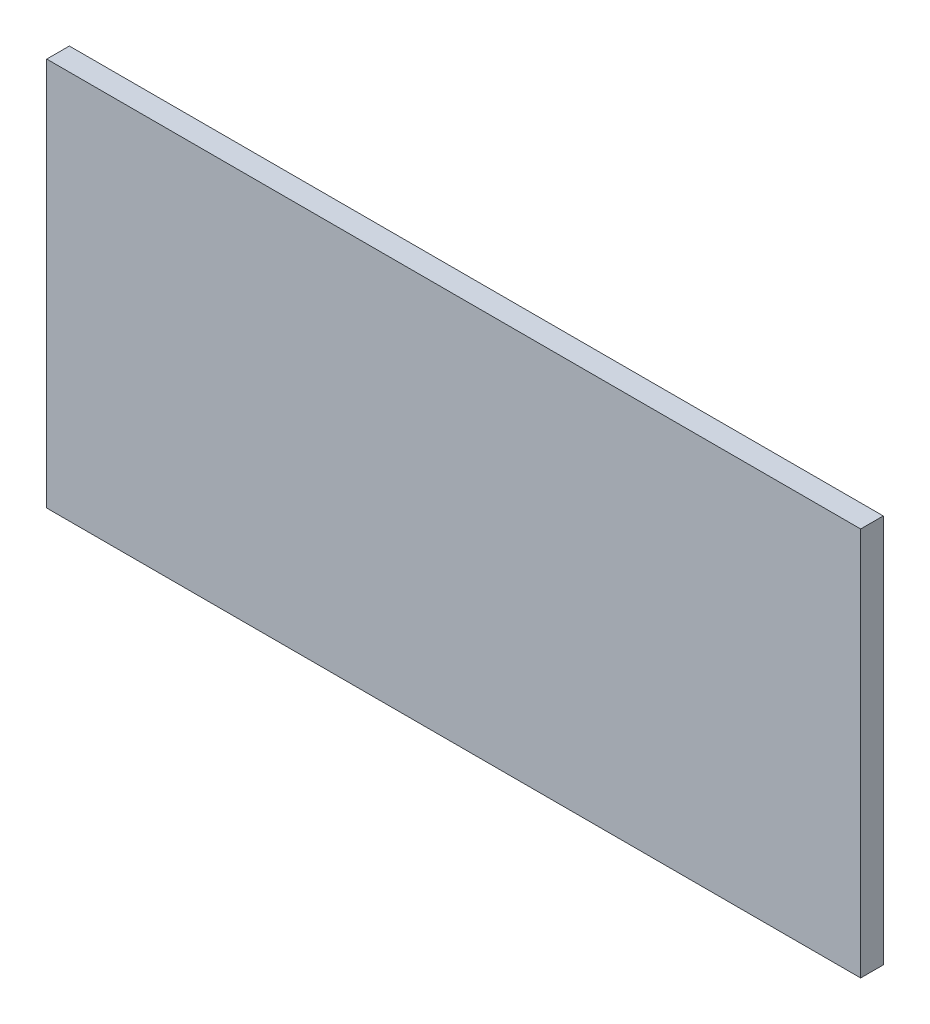
ISO-10303-21;
HEADER;
FILE_DESCRIPTION(('STEP AP214'),'2;1');
FILE_NAME('part.step','',(''),(''),'','','');
FILE_SCHEMA(('AUTOMOTIVE_DESIGN { 1 0 10303 214 1 1 1 1 }'));
ENDSEC;
DATA;
#1=APPLICATION_CONTEXT('core data for automotive mechanical design processes');
#2=APPLICATION_PROTOCOL_DEFINITION('international standard','automotive_design',2000,#1);
#3=PRODUCT_CONTEXT('',#1,'mechanical');
#4=PRODUCT('Part','Part','',(#3));
#5=PRODUCT_RELATED_PRODUCT_CATEGORY('part','',(#4));
#6=PRODUCT_DEFINITION_FORMATION('','',#4);
#7=PRODUCT_DEFINITION_CONTEXT('part definition',#1,'design');
#8=PRODUCT_DEFINITION('design','',#6,#7);
#9=PRODUCT_DEFINITION_SHAPE('','',#8);
#10=(LENGTH_UNIT() NAMED_UNIT(*) SI_UNIT(.MILLI.,.METRE.));
#11=(NAMED_UNIT(*) PLANE_ANGLE_UNIT() SI_UNIT($,.RADIAN.));
#12=(NAMED_UNIT(*) SI_UNIT($,.STERADIAN.) SOLID_ANGLE_UNIT());
#13=UNCERTAINTY_MEASURE_WITH_UNIT(LENGTH_MEASURE(1.E-05),#10,'distance_accuracy_value','');
#14=(GEOMETRIC_REPRESENTATION_CONTEXT(3) GLOBAL_UNCERTAINTY_ASSIGNED_CONTEXT((#13)) GLOBAL_UNIT_ASSIGNED_CONTEXT((#10,
#11,#12)) REPRESENTATION_CONTEXT('',''));
#15=CARTESIAN_POINT('',(0.,0.,0.));
#16=DIRECTION('',(0.,0.,1.));
#17=DIRECTION('',(1.,0.,0.));
#18=AXIS2_PLACEMENT_3D('',#15,#16,#17);
#19=CARTESIAN_POINT('',(-45.,-21.5,2.5));
#20=DIRECTION('',(1.,0.,0.));
#21=DIRECTION('',(0.,0.,-1.));
#22=AXIS2_PLACEMENT_3D('',#19,#20,#21);
#23=PLANE('',#22);
#24=DIRECTION('',(0.,-1.,0.));
#25=VECTOR('',#24,1.);
#26=CARTESIAN_POINT('',(-45.,-21.5,0.));
#27=LINE('',#26,#25);
#28=CARTESIAN_POINT('',(-45.,21.5,0.));
#29=VERTEX_POINT('',#28);
#30=CARTESIAN_POINT('',(-45.,-21.5,0.));
#31=VERTEX_POINT('',#30);
#32=EDGE_CURVE('E96',#29,#31,#27,.T.);
#33=ORIENTED_EDGE('',*,*,#32,.T.);
#34=DIRECTION('',(0.,0.,-1.));
#35=VECTOR('',#34,1.);
#36=CARTESIAN_POINT('',(-45.,-21.5,2.5));
#37=LINE('',#36,#35);
#38=CARTESIAN_POINT('',(-45.,-21.5,2.5));
#39=VERTEX_POINT('',#38);
#40=EDGE_CURVE('E11',#39,#31,#37,.T.);
#41=ORIENTED_EDGE('',*,*,#40,.F.);
#42=DIRECTION('',(0.,-1.,0.));
#43=VECTOR('',#42,1.);
#44=CARTESIAN_POINT('',(-45.,-21.5,2.5));
#45=LINE('',#44,#43);
#46=CARTESIAN_POINT('',(-45.,21.5,2.5));
#47=VERTEX_POINT('',#46);
#48=EDGE_CURVE('E84',#47,#39,#45,.T.);
#49=ORIENTED_EDGE('',*,*,#48,.F.);
#50=DIRECTION('',(0.,0.,-1.));
#51=VECTOR('',#50,1.);
#52=CARTESIAN_POINT('',(-45.,21.5,2.5));
#53=LINE('',#52,#51);
#54=EDGE_CURVE('E92',#47,#29,#53,.T.);
#55=ORIENTED_EDGE('',*,*,#54,.T.);
#56=EDGE_LOOP('',(#33,#41,#49,#55));
#57=FACE_BOUND('',#56,.T.);
#58=ADVANCED_FACE('F33',(#57),#23,.F.);
#59=CARTESIAN_POINT('',(45.,-21.5,2.5));
#60=DIRECTION('',(0.,1.,0.));
#61=DIRECTION('',(0.,0.,1.));
#62=AXIS2_PLACEMENT_3D('',#59,#60,#61);
#63=PLANE('',#62);
#64=DIRECTION('',(1.,0.,0.));
#65=VECTOR('',#64,1.);
#66=CARTESIAN_POINT('',(45.,-21.5,0.));
#67=LINE('',#66,#65);
#68=CARTESIAN_POINT('',(45.,-21.5,0.));
#69=VERTEX_POINT('',#68);
#70=EDGE_CURVE('E88',#31,#69,#67,.T.);
#71=ORIENTED_EDGE('',*,*,#70,.T.);
#72=DIRECTION('',(0.,0.,-1.));
#73=VECTOR('',#72,1.);
#74=CARTESIAN_POINT('',(45.,-21.5,2.5));
#75=LINE('',#74,#73);
#76=CARTESIAN_POINT('',(45.,-21.5,2.5));
#77=VERTEX_POINT('',#76);
#78=EDGE_CURVE('E41',#77,#69,#75,.T.);
#79=ORIENTED_EDGE('',*,*,#78,.F.);
#80=DIRECTION('',(1.,0.,0.));
#81=VECTOR('',#80,1.);
#82=CARTESIAN_POINT('',(45.,-21.5,2.5));
#83=LINE('',#82,#81);
#84=EDGE_CURVE('E79',#39,#77,#83,.T.);
#85=ORIENTED_EDGE('',*,*,#84,.F.);
#86=ORIENTED_EDGE('',*,*,#40,.T.);
#87=EDGE_LOOP('',(#71,#79,#85,#86));
#88=FACE_BOUND('',#87,.T.);
#89=ADVANCED_FACE('F87',(#88),#63,.F.);
#90=CARTESIAN_POINT('',(45.,-21.5,2.5));
#91=DIRECTION('',(-1.,0.,0.));
#92=DIRECTION('',(0.,0.,1.));
#93=AXIS2_PLACEMENT_3D('',#90,#91,#92);
#94=PLANE('',#93);
#95=DIRECTION('',(0.,1.,0.));
#96=VECTOR('',#95,1.);
#97=CARTESIAN_POINT('',(45.,-21.5,0.));
#98=LINE('',#97,#96);
#99=CARTESIAN_POINT('',(45.,21.5,0.));
#100=VERTEX_POINT('',#99);
#101=EDGE_CURVE('E66',#69,#100,#98,.T.);
#102=ORIENTED_EDGE('',*,*,#101,.T.);
#103=DIRECTION('',(0.,0.,-1.));
#104=VECTOR('',#103,1.);
#105=CARTESIAN_POINT('',(45.,21.5,2.5));
#106=LINE('',#105,#104);
#107=CARTESIAN_POINT('',(45.,21.5,2.5));
#108=VERTEX_POINT('',#107);
#109=EDGE_CURVE('E89',#108,#100,#106,.T.);
#110=ORIENTED_EDGE('',*,*,#109,.F.);
#111=DIRECTION('',(0.,1.,0.));
#112=VECTOR('',#111,1.);
#113=CARTESIAN_POINT('',(45.,-21.5,2.5));
#114=LINE('',#113,#112);
#115=EDGE_CURVE('E82',#77,#108,#114,.T.);
#116=ORIENTED_EDGE('',*,*,#115,.F.);
#117=ORIENTED_EDGE('',*,*,#78,.T.);
#118=EDGE_LOOP('',(#102,#110,#116,#117));
#119=FACE_BOUND('',#118,.T.);
#120=ADVANCED_FACE('F90',(#119),#94,.F.);
#121=CARTESIAN_POINT('',(45.,21.5,2.5));
#122=DIRECTION('',(0.,-1.,0.));
#123=DIRECTION('',(0.,0.,-1.));
#124=AXIS2_PLACEMENT_3D('',#121,#122,#123);
#125=PLANE('',#124);
#126=DIRECTION('',(-1.,0.,0.));
#127=VECTOR('',#126,1.);
#128=CARTESIAN_POINT('',(45.,21.5,0.));
#129=LINE('',#128,#127);
#130=EDGE_CURVE('E72',#100,#29,#129,.T.);
#131=ORIENTED_EDGE('',*,*,#130,.T.);
#132=ORIENTED_EDGE('',*,*,#54,.F.);
#133=DIRECTION('',(-1.,0.,0.));
#134=VECTOR('',#133,1.);
#135=CARTESIAN_POINT('',(45.,21.5,2.5));
#136=LINE('',#135,#134);
#137=EDGE_CURVE('E49',#108,#47,#136,.T.);
#138=ORIENTED_EDGE('',*,*,#137,.F.);
#139=ORIENTED_EDGE('',*,*,#109,.T.);
#140=EDGE_LOOP('',(#131,#132,#138,#139));
#141=FACE_BOUND('',#140,.T.);
#142=ADVANCED_FACE('F103',(#141),#125,.F.);
#143=CARTESIAN_POINT('',(0.,0.,2.5));
#144=DIRECTION('',(0.,0.,1.));
#145=DIRECTION('',(1.,0.,0.));
#146=AXIS2_PLACEMENT_3D('',#143,#144,#145);
#147=PLANE('',#146);
#148=ORIENTED_EDGE('',*,*,#48,.T.);
#149=ORIENTED_EDGE('',*,*,#84,.T.);
#150=ORIENTED_EDGE('',*,*,#115,.T.);
#151=ORIENTED_EDGE('',*,*,#137,.T.);
#152=EDGE_LOOP('',(#148,#149,#150,#151));
#153=FACE_BOUND('',#152,.T.);
#154=ADVANCED_FACE('F80',(#153),#147,.T.);
#155=CARTESIAN_POINT('',(0.,0.,0.));
#156=DIRECTION('',(0.,0.,1.));
#157=DIRECTION('',(1.,0.,0.));
#158=AXIS2_PLACEMENT_3D('',#155,#156,#157);
#159=PLANE('',#158);
#160=ORIENTED_EDGE('',*,*,#32,.F.);
#161=ORIENTED_EDGE('',*,*,#130,.F.);
#162=ORIENTED_EDGE('',*,*,#101,.F.);
#163=ORIENTED_EDGE('',*,*,#70,.F.);
#164=EDGE_LOOP('',(#160,#161,#162,#163));
#165=FACE_BOUND('',#164,.T.);
#166=ADVANCED_FACE('F106',(#165),#159,.F.);
#167=CLOSED_SHELL('',(#58,#89,#120,#142,#154,#166));
#168=MANIFOLD_SOLID_BREP('B2',#167);
#169=ADVANCED_BREP_SHAPE_REPRESENTATION('',(#18,#168),#14);
#170=SHAPE_DEFINITION_REPRESENTATION(#9,#169);
ENDSEC;
END-ISO-10303-21;
